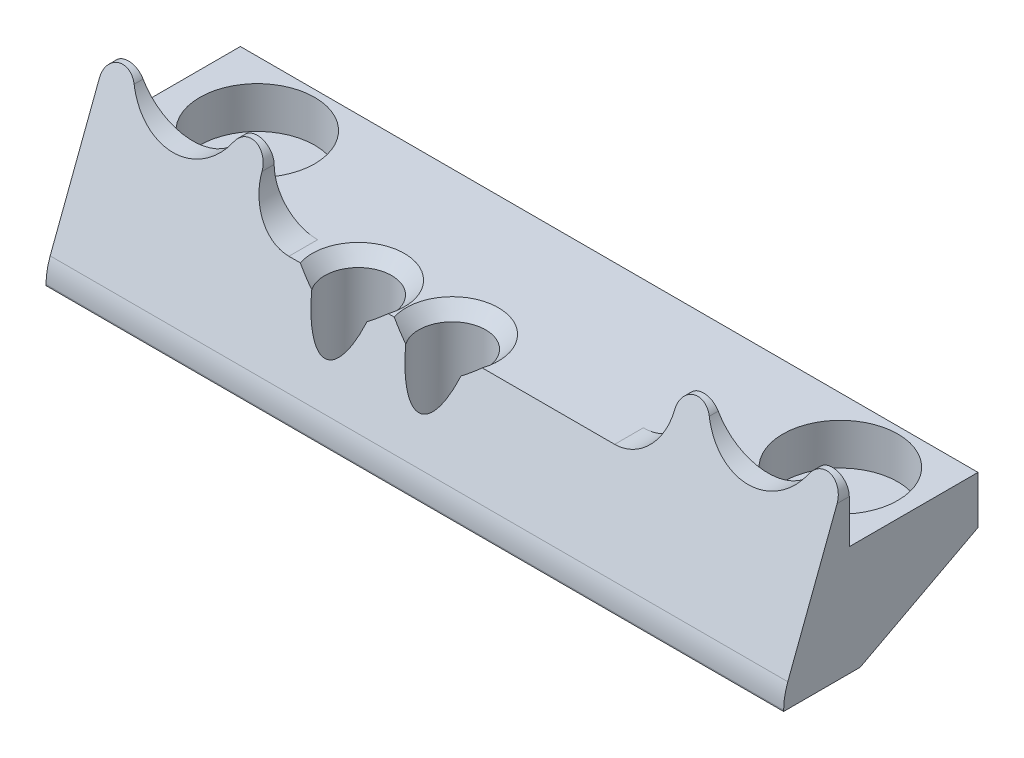
ISO-10303-21;
HEADER;
FILE_DESCRIPTION(('STEP AP214'),'2;1');
FILE_NAME('part.step','',(''),(''),'','','');
FILE_SCHEMA(('AUTOMOTIVE_DESIGN { 1 0 10303 214 1 1 1 1 }'));
ENDSEC;
DATA;
#1=APPLICATION_CONTEXT('core data for automotive mechanical design processes');
#2=APPLICATION_PROTOCOL_DEFINITION('international standard','automotive_design',2000,#1);
#3=PRODUCT_CONTEXT('',#1,'mechanical');
#4=PRODUCT('Part','Part','',(#3));
#5=PRODUCT_RELATED_PRODUCT_CATEGORY('part','',(#4));
#6=PRODUCT_DEFINITION_FORMATION('','',#4);
#7=PRODUCT_DEFINITION_CONTEXT('part definition',#1,'design');
#8=PRODUCT_DEFINITION('design','',#6,#7);
#9=PRODUCT_DEFINITION_SHAPE('','',#8);
#10=(LENGTH_UNIT() NAMED_UNIT(*) SI_UNIT(.MILLI.,.METRE.));
#11=(NAMED_UNIT(*) PLANE_ANGLE_UNIT() SI_UNIT($,.RADIAN.));
#12=(NAMED_UNIT(*) SI_UNIT($,.STERADIAN.) SOLID_ANGLE_UNIT());
#13=UNCERTAINTY_MEASURE_WITH_UNIT(LENGTH_MEASURE(1.E-05),#10,'distance_accuracy_value','');
#14=(GEOMETRIC_REPRESENTATION_CONTEXT(3) GLOBAL_UNCERTAINTY_ASSIGNED_CONTEXT((#13)) GLOBAL_UNIT_ASSIGNED_CONTEXT((#10,
#11,#12)) REPRESENTATION_CONTEXT('',''));
#15=CARTESIAN_POINT('',(0.,0.,0.));
#16=DIRECTION('',(0.,0.,1.));
#17=DIRECTION('',(1.,0.,0.));
#18=AXIS2_PLACEMENT_3D('',#15,#16,#17);
#19=CARTESIAN_POINT('',(0.,17.25,0.));
#20=DIRECTION('',(0.,-1.,0.));
#21=DIRECTION('',(0.,0.,-1.));
#22=AXIS2_PLACEMENT_3D('',#19,#20,#21);
#23=PLANE('',#22);
#24=CARTESIAN_POINT('',(-43.,17.25,-12.4));
#25=DIRECTION('',(0.,1.,0.));
#26=DIRECTION('',(0.,0.,1.));
#27=AXIS2_PLACEMENT_3D('',#24,#25,#26);
#28=CIRCLE('',#27,9.02499999999999);
#29=CARTESIAN_POINT('',(-43.,17.25,-3.37500000000001));
#30=VERTEX_POINT('',#29);
#31=EDGE_CURVE('E308',#30,#30,#28,.T.);
#32=ORIENTED_EDGE('',*,*,#31,.F.);
#33=EDGE_LOOP('',(#32));
#34=FACE_BOUND('',#33,.T.);
#35=CARTESIAN_POINT('',(48.5,17.25,-12.4));
#36=DIRECTION('',(0.,1.,0.));
#37=DIRECTION('',(0.,0.,1.));
#38=AXIS2_PLACEMENT_3D('',#35,#36,#37);
#39=CIRCLE('',#38,9.02499999999999);
#40=CARTESIAN_POINT('',(48.5,17.25,-3.37500000000001));
#41=VERTEX_POINT('',#40);
#42=EDGE_CURVE('E311',#41,#41,#39,.T.);
#43=ORIENTED_EDGE('',*,*,#42,.F.);
#44=EDGE_LOOP('',(#43));
#45=FACE_BOUND('',#44,.T.);
#46=DIRECTION('',(1.,0.,0.));
#47=VECTOR('',#46,1.);
#48=CARTESIAN_POINT('',(-55.75,17.25,2.2));
#49=LINE('',#48,#47);
#50=CARTESIAN_POINT('',(-7.84185263619838,17.25,2.2));
#51=VERTEX_POINT('',#50);
#52=CARTESIAN_POINT('',(-6.90814736380167,17.25,2.2));
#53=VERTEX_POINT('',#52);
#54=EDGE_CURVE('E276',#51,#53,#49,.T.);
#55=ORIENTED_EDGE('',*,*,#54,.T.);
#56=CARTESIAN_POINT('',(0.,17.25,0.));
#57=DIRECTION('',(0.,-1.,0.));
#58=DIRECTION('',(0.,0.,-1.));
#59=AXIS2_PLACEMENT_3D('',#56,#57,#58);
#60=CIRCLE('',#59,7.24999999999999);
#61=CARTESIAN_POINT('',(6.90814736380166,17.25,2.2));
#62=VERTEX_POINT('',#61);
#63=EDGE_CURVE('E46',#53,#62,#60,.T.);
#64=ORIENTED_EDGE('',*,*,#63,.T.);
#65=CARTESIAN_POINT('',(27.6845936651877,17.25,2.2));
#66=VERTEX_POINT('',#65);
#67=EDGE_CURVE('E277',#62,#66,#49,.T.);
#68=ORIENTED_EDGE('',*,*,#67,.T.);
#69=DIRECTION('',(0.,0.,-1.));
#70=VECTOR('',#69,1.);
#71=CARTESIAN_POINT('',(27.6845936651877,17.25,35.2491485571849));
#72=LINE('',#71,#70);
#73=CARTESIAN_POINT('',(27.6845936651877,17.25,-2.3));
#74=VERTEX_POINT('',#73);
#75=EDGE_CURVE('E260',#66,#74,#72,.T.);
#76=ORIENTED_EDGE('',*,*,#75,.T.);
#77=DIRECTION('',(-1.,0.,0.));
#78=VECTOR('',#77,1.);
#79=CARTESIAN_POINT('',(0.,17.25,-2.3));
#80=LINE('',#79,#78);
#81=CARTESIAN_POINT('',(60.,17.25,-2.3));
#82=VERTEX_POINT('',#81);
#83=EDGE_CURVE('E242',#82,#74,#80,.T.);
#84=ORIENTED_EDGE('',*,*,#83,.F.);
#85=DIRECTION('',(0.,0.,-1.));
#86=VECTOR('',#85,1.);
#87=CARTESIAN_POINT('',(60.,17.25,8.));
#88=LINE('',#87,#86);
#89=CARTESIAN_POINT('',(60.,17.25,-22.5));
#90=VERTEX_POINT('',#89);
#91=EDGE_CURVE('E323',#82,#90,#88,.T.);
#92=ORIENTED_EDGE('',*,*,#91,.T.);
#93=DIRECTION('',(-1.,0.,0.));
#94=VECTOR('',#93,1.);
#95=CARTESIAN_POINT('',(-55.75,17.25,-22.5));
#96=LINE('',#95,#94);
#97=CARTESIAN_POINT('',(-55.75,17.25,-22.5));
#98=VERTEX_POINT('',#97);
#99=EDGE_CURVE('E326',#90,#98,#96,.T.);
#100=ORIENTED_EDGE('',*,*,#99,.T.);
#101=DIRECTION('',(0.,0.,1.));
#102=VECTOR('',#101,1.);
#103=CARTESIAN_POINT('',(-55.75,17.25,8.));
#104=LINE('',#103,#102);
#105=CARTESIAN_POINT('',(-55.75,17.25,-2.3));
#106=VERTEX_POINT('',#105);
#107=EDGE_CURVE('E321',#98,#106,#104,.T.);
#108=ORIENTED_EDGE('',*,*,#107,.T.);
#109=DIRECTION('',(1.,0.,0.));
#110=VECTOR('',#109,1.);
#111=CARTESIAN_POINT('',(-55.75,17.25,-2.3));
#112=LINE('',#111,#110);
#113=CARTESIAN_POINT('',(-23.4345936651877,17.25,-2.3));
#114=VERTEX_POINT('',#113);
#115=EDGE_CURVE('E220',#106,#114,#112,.T.);
#116=ORIENTED_EDGE('',*,*,#115,.T.);
#117=DIRECTION('',(0.,0.,-1.));
#118=VECTOR('',#117,1.);
#119=CARTESIAN_POINT('',(-23.4345936651877,17.25,35.2491485571849));
#120=LINE('',#119,#118);
#121=CARTESIAN_POINT('',(-23.4345936651877,17.25,2.2));
#122=VERTEX_POINT('',#121);
#123=EDGE_CURVE('E489',#122,#114,#120,.T.);
#124=ORIENTED_EDGE('',*,*,#123,.F.);
#125=CARTESIAN_POINT('',(-21.6581473638016,17.25,2.2));
#126=VERTEX_POINT('',#125);
#127=EDGE_CURVE('E273',#122,#126,#49,.T.);
#128=ORIENTED_EDGE('',*,*,#127,.T.);
#129=CARTESIAN_POINT('',(-14.75,17.25,0.));
#130=DIRECTION('',(0.,-1.,0.));
#131=DIRECTION('',(0.,0.,-1.));
#132=AXIS2_PLACEMENT_3D('',#129,#130,#131);
#133=CIRCLE('',#132,7.24999999999995);
#134=EDGE_CURVE('E526',#126,#51,#133,.T.);
#135=ORIENTED_EDGE('',*,*,#134,.T.);
#136=EDGE_LOOP('',(#55,#64,#68,#76,#84,#92,#100,#108,#116,#124,#128,#135));
#137=FACE_BOUND('',#136,.T.);
#138=ADVANCED_FACE('F37',(#34,#45,#137),#23,.F.);
#139=CARTESIAN_POINT('',(-43.,17.25,-12.4));
#140=DIRECTION('',(0.,-1.,0.));
#141=DIRECTION('',(0.,0.,-1.));
#142=AXIS2_PLACEMENT_3D('',#139,#140,#141);
#143=CYLINDRICAL_SURFACE('',#142,9.02499999999999);
#144=ORIENTED_EDGE('',*,*,#31,.T.);
#145=EDGE_LOOP('',(#144));
#146=FACE_BOUND('',#145,.T.);
#147=CARTESIAN_POINT('',(-43.,10.75,-12.4));
#148=DIRECTION('',(0.,-1.,0.));
#149=DIRECTION('',(0.,0.,-1.));
#150=AXIS2_PLACEMENT_3D('',#147,#148,#149);
#151=CIRCLE('',#150,9.025);
#152=CARTESIAN_POINT('',(-43.,10.75,-21.425));
#153=VERTEX_POINT('',#152);
#154=EDGE_CURVE('E301',#153,#153,#151,.F.);
#155=ORIENTED_EDGE('',*,*,#154,.F.);
#156=EDGE_LOOP('',(#155));
#157=FACE_BOUND('',#156,.T.);
#158=ADVANCED_FACE('F424',(#146,#157),#143,.F.);
#159=CARTESIAN_POINT('',(48.5,17.25,-12.4));
#160=DIRECTION('',(0.,-1.,0.));
#161=DIRECTION('',(0.,0.,-1.));
#162=AXIS2_PLACEMENT_3D('',#159,#160,#161);
#163=CYLINDRICAL_SURFACE('',#162,9.02499999999999);
#164=ORIENTED_EDGE('',*,*,#42,.T.);
#165=EDGE_LOOP('',(#164));
#166=FACE_BOUND('',#165,.T.);
#167=CARTESIAN_POINT('',(48.5,10.75,-12.4));
#168=DIRECTION('',(0.,-1.,0.));
#169=DIRECTION('',(0.,0.,-1.));
#170=AXIS2_PLACEMENT_3D('',#167,#168,#169);
#171=CIRCLE('',#170,9.025);
#172=CARTESIAN_POINT('',(48.5,10.75,-21.425));
#173=VERTEX_POINT('',#172);
#174=EDGE_CURVE('E304',#173,#173,#171,.F.);
#175=ORIENTED_EDGE('',*,*,#174,.F.);
#176=EDGE_LOOP('',(#175));
#177=FACE_BOUND('',#176,.T.);
#178=ADVANCED_FACE('F420',(#166,#177),#163,.F.);
#179=CARTESIAN_POINT('',(0.,0.,0.));
#180=DIRECTION('',(0.,-1.,0.));
#181=DIRECTION('',(0.,0.,-1.));
#182=AXIS2_PLACEMENT_3D('',#179,#180,#181);
#183=PLANE('',#182);
#184=DIRECTION('',(1.,0.,0.));
#185=VECTOR('',#184,1.);
#186=CARTESIAN_POINT('',(-55.75,0.,-4.));
#187=LINE('',#186,#185);
#188=CARTESIAN_POINT('',(-55.75,0.,-4.));
#189=VERTEX_POINT('',#188);
#190=CARTESIAN_POINT('',(60.,0.,-4.));
#191=VERTEX_POINT('',#190);
#192=EDGE_CURVE('E270',#189,#191,#187,.T.);
#193=ORIENTED_EDGE('',*,*,#192,.T.);
#194=DIRECTION('',(0.,0.,-1.));
#195=VECTOR('',#194,1.);
#196=CARTESIAN_POINT('',(60.,0.,8.));
#197=LINE('',#196,#195);
#198=CARTESIAN_POINT('',(60.,0.,8.));
#199=VERTEX_POINT('',#198);
#200=EDGE_CURVE('E324',#199,#191,#197,.T.);
#201=ORIENTED_EDGE('',*,*,#200,.F.);
#202=DIRECTION('',(1.,0.,0.));
#203=VECTOR('',#202,1.);
#204=CARTESIAN_POINT('',(-55.75,0.,8.));
#205=LINE('',#204,#203);
#206=CARTESIAN_POINT('',(-55.75,0.,8.));
#207=VERTEX_POINT('',#206);
#208=EDGE_CURVE('E330',#207,#199,#205,.T.);
#209=ORIENTED_EDGE('',*,*,#208,.F.);
#210=DIRECTION('',(0.,0.,1.));
#211=VECTOR('',#210,1.);
#212=CARTESIAN_POINT('',(-55.75,0.,8.));
#213=LINE('',#212,#211);
#214=EDGE_CURVE('E320',#189,#207,#213,.T.);
#215=ORIENTED_EDGE('',*,*,#214,.F.);
#216=EDGE_LOOP('',(#193,#201,#209,#215));
#217=FACE_BOUND('',#216,.T.);
#218=CARTESIAN_POINT('',(0.,0.,0.));
#219=DIRECTION('',(0.,1.,0.));
#220=DIRECTION('',(0.,0.,1.));
#221=AXIS2_PLACEMENT_3D('',#218,#219,#220);
#222=CIRCLE('',#221,2.75);
#223=CARTESIAN_POINT('',(0.,0.,2.75));
#224=VERTEX_POINT('',#223);
#225=EDGE_CURVE('E317',#224,#224,#222,.T.);
#226=ORIENTED_EDGE('',*,*,#225,.T.);
#227=EDGE_LOOP('',(#226));
#228=FACE_BOUND('',#227,.T.);
#229=CARTESIAN_POINT('',(-14.75,0.,0.));
#230=DIRECTION('',(0.,1.,0.));
#231=DIRECTION('',(0.,0.,1.));
#232=AXIS2_PLACEMENT_3D('',#229,#230,#231);
#233=CIRCLE('',#232,2.75);
#234=CARTESIAN_POINT('',(-14.75,0.,2.75));
#235=VERTEX_POINT('',#234);
#236=EDGE_CURVE('E314',#235,#235,#233,.T.);
#237=ORIENTED_EDGE('',*,*,#236,.T.);
#238=EDGE_LOOP('',(#237));
#239=FACE_BOUND('',#238,.T.);
#240=ADVANCED_FACE('F404',(#217,#228,#239),#183,.T.);
#241=CARTESIAN_POINT('',(-55.75,17.25,8.));
#242=DIRECTION('',(1.,0.,0.));
#243=DIRECTION('',(0.,0.,-1.));
#244=AXIS2_PLACEMENT_3D('',#241,#242,#243);
#245=PLANE('',#244);
#246=CARTESIAN_POINT('',(-55.75,0.162563301635661,-2.));
#247=DIRECTION('',(-1.,0.,0.));
#248=DIRECTION('',(0.,0.,-1.));
#249=AXIS2_PLACEMENT_3D('',#246,#247,#248);
#250=CIRCLE('',#249,10.);
#251=CARTESIAN_POINT('',(-55.75,0.162563301635627,8.));
#252=VERTEX_POINT('',#251);
#253=CARTESIAN_POINT('',(-55.75,3.71741861115749,7.34681783969092));
#254=VERTEX_POINT('',#253);
#255=EDGE_CURVE('E266',#252,#254,#250,.T.);
#256=ORIENTED_EDGE('',*,*,#255,.T.);
#257=DIRECTION('',(0.,0.934681783969093,-0.35548553095218));
#258=VECTOR('',#257,1.);
#259=CARTESIAN_POINT('',(-55.75,17.25,2.2));
#260=LINE('',#259,#258);
#261=CARTESIAN_POINT('',(-55.75,24.0654063348123,-0.392088966682721));
#262=VERTEX_POINT('',#261);
#263=EDGE_CURVE('E269',#254,#262,#260,.T.);
#264=ORIENTED_EDGE('',*,*,#263,.T.);
#265=DIRECTION('',(0.,0.,-1.));
#266=VECTOR('',#265,1.);
#267=CARTESIAN_POINT('',(-55.75,24.0654063348123,35.2491485571849));
#268=LINE('',#267,#266);
#269=CARTESIAN_POINT('',(-55.75,24.0654063348123,-2.3));
#270=VERTEX_POINT('',#269);
#271=EDGE_CURVE('E206',#262,#270,#268,.T.);
#272=ORIENTED_EDGE('',*,*,#271,.T.);
#273=DIRECTION('',(0.,1.,0.));
#274=VECTOR('',#273,1.);
#275=CARTESIAN_POINT('',(-55.75,17.25,-2.3));
#276=LINE('',#275,#274);
#277=EDGE_CURVE('E217',#106,#270,#276,.T.);
#278=ORIENTED_EDGE('',*,*,#277,.F.);
#279=ORIENTED_EDGE('',*,*,#107,.F.);
#280=DIRECTION('',(0.,-1.,0.));
#281=VECTOR('',#280,1.);
#282=CARTESIAN_POINT('',(-55.75,17.25,-22.5));
#283=LINE('',#282,#281);
#284=CARTESIAN_POINT('',(-55.75,9.75,-22.5));
#285=VERTEX_POINT('',#284);
#286=EDGE_CURVE('E328',#98,#285,#283,.T.);
#287=ORIENTED_EDGE('',*,*,#286,.T.);
#288=DIRECTION('',(0.,-0.46623907672076,0.884658760957339));
#289=VECTOR('',#288,1.);
#290=CARTESIAN_POINT('',(-55.75,9.75,-22.5));
#291=LINE('',#290,#289);
#292=EDGE_CURVE('E236',#285,#189,#291,.T.);
#293=ORIENTED_EDGE('',*,*,#292,.T.);
#294=ORIENTED_EDGE('',*,*,#214,.T.);
#295=DIRECTION('',(0.,-1.,0.));
#296=VECTOR('',#295,1.);
#297=CARTESIAN_POINT('',(-55.75,17.25,8.));
#298=LINE('',#297,#296);
#299=EDGE_CURVE('E342',#252,#207,#298,.T.);
#300=ORIENTED_EDGE('',*,*,#299,.F.);
#301=EDGE_LOOP('',(#256,#264,#272,#278,#279,#287,#293,#294,#300));
#302=FACE_BOUND('',#301,.T.);
#303=ADVANCED_FACE('F399',(#302),#245,.F.);
#304=CARTESIAN_POINT('',(-55.75,17.25,8.));
#305=DIRECTION('',(0.,0.,-1.));
#306=DIRECTION('',(-1.,0.,0.));
#307=AXIS2_PLACEMENT_3D('',#304,#305,#306);
#308=PLANE('',#307);
#309=DIRECTION('',(0.,-1.,0.));
#310=VECTOR('',#309,1.);
#311=CARTESIAN_POINT('',(60.,17.25,8.));
#312=LINE('',#311,#310);
#313=CARTESIAN_POINT('',(60.,0.162563301635644,8.));
#314=VERTEX_POINT('',#313);
#315=EDGE_CURVE('E340',#314,#199,#312,.T.);
#316=ORIENTED_EDGE('',*,*,#315,.F.);
#317=DIRECTION('',(1.,0.,0.));
#318=VECTOR('',#317,1.);
#319=CARTESIAN_POINT('',(-55.75,0.162563301635627,8.));
#320=LINE('',#319,#318);
#321=EDGE_CURVE('E272',#252,#314,#320,.T.);
#322=ORIENTED_EDGE('',*,*,#321,.F.);
#323=ORIENTED_EDGE('',*,*,#299,.T.);
#324=ORIENTED_EDGE('',*,*,#208,.T.);
#325=EDGE_LOOP('',(#316,#322,#323,#324));
#326=FACE_BOUND('',#325,.T.);
#327=ADVANCED_FACE('F403',(#326),#308,.F.);
#328=CARTESIAN_POINT('',(60.,17.25,8.));
#329=DIRECTION('',(-1.,0.,0.));
#330=DIRECTION('',(0.,0.,1.));
#331=AXIS2_PLACEMENT_3D('',#328,#329,#330);
#332=PLANE('',#331);
#333=ORIENTED_EDGE('',*,*,#91,.F.);
#334=DIRECTION('',(0.,1.,0.));
#335=VECTOR('',#334,1.);
#336=CARTESIAN_POINT('',(60.,0.,-2.3));
#337=LINE('',#336,#335);
#338=CARTESIAN_POINT('',(60.,24.0654063348123,-2.3));
#339=VERTEX_POINT('',#338);
#340=EDGE_CURVE('E245',#82,#339,#337,.T.);
#341=ORIENTED_EDGE('',*,*,#340,.T.);
#342=DIRECTION('',(0.,0.,-1.));
#343=VECTOR('',#342,1.);
#344=CARTESIAN_POINT('',(60.,24.0654063348123,35.2491485571849));
#345=LINE('',#344,#343);
#346=CARTESIAN_POINT('',(60.,24.0654063348123,-0.392088966682726));
#347=VERTEX_POINT('',#346);
#348=EDGE_CURVE('E258',#347,#339,#345,.T.);
#349=ORIENTED_EDGE('',*,*,#348,.F.);
#350=DIRECTION('',(0.,-0.934681783969094,0.35548553095218));
#351=VECTOR('',#350,1.);
#352=CARTESIAN_POINT('',(60.,15.3228580685756,2.93294578375485));
#353=LINE('',#352,#351);
#354=CARTESIAN_POINT('',(60.,3.71741861115748,7.34681783969093));
#355=VERTEX_POINT('',#354);
#356=EDGE_CURVE('E288',#347,#355,#353,.T.);
#357=ORIENTED_EDGE('',*,*,#356,.T.);
#358=CARTESIAN_POINT('',(60.,0.162563301635661,-2.));
#359=DIRECTION('',(1.,0.,0.));
#360=DIRECTION('',(0.,0.,-1.));
#361=AXIS2_PLACEMENT_3D('',#358,#359,#360);
#362=CIRCLE('',#361,10.);
#363=EDGE_CURVE('E352',#355,#314,#362,.T.);
#364=ORIENTED_EDGE('',*,*,#363,.T.);
#365=ORIENTED_EDGE('',*,*,#315,.T.);
#366=ORIENTED_EDGE('',*,*,#200,.T.);
#367=DIRECTION('',(0.,0.46623907672076,-0.884658760957339));
#368=VECTOR('',#367,1.);
#369=CARTESIAN_POINT('',(60.,-1.19976418465056,-1.72352436758611));
#370=LINE('',#369,#368);
#371=CARTESIAN_POINT('',(60.,9.75,-22.5));
#372=VERTEX_POINT('',#371);
#373=EDGE_CURVE('E291',#191,#372,#370,.T.);
#374=ORIENTED_EDGE('',*,*,#373,.T.);
#375=DIRECTION('',(0.,-1.,0.));
#376=VECTOR('',#375,1.);
#377=CARTESIAN_POINT('',(60.,17.25,-22.5));
#378=LINE('',#377,#376);
#379=EDGE_CURVE('E337',#90,#372,#378,.T.);
#380=ORIENTED_EDGE('',*,*,#379,.F.);
#381=EDGE_LOOP('',(#333,#341,#349,#357,#364,#365,#366,#374,#380));
#382=FACE_BOUND('',#381,.T.);
#383=ADVANCED_FACE('F408',(#382),#332,.F.);
#384=CARTESIAN_POINT('',(-55.75,17.25,-22.5));
#385=DIRECTION('',(0.,0.,1.));
#386=DIRECTION('',(1.,0.,0.));
#387=AXIS2_PLACEMENT_3D('',#384,#385,#386);
#388=PLANE('',#387);
#389=ORIENTED_EDGE('',*,*,#379,.T.);
#390=DIRECTION('',(1.,0.,0.));
#391=VECTOR('',#390,1.);
#392=CARTESIAN_POINT('',(-55.75,9.75,-22.5));
#393=LINE('',#392,#391);
#394=EDGE_CURVE('E283',#285,#372,#393,.T.);
#395=ORIENTED_EDGE('',*,*,#394,.F.);
#396=ORIENTED_EDGE('',*,*,#286,.F.);
#397=ORIENTED_EDGE('',*,*,#99,.F.);
#398=EDGE_LOOP('',(#389,#395,#396,#397));
#399=FACE_BOUND('',#398,.T.);
#400=ADVANCED_FACE('F412',(#399),#388,.F.);
#401=CARTESIAN_POINT('',(0.,17.25,0.));
#402=DIRECTION('',(0.,-1.,0.));
#403=DIRECTION('',(0.,0.,-1.));
#404=AXIS2_PLACEMENT_3D('',#401,#402,#403);
#405=CYLINDRICAL_SURFACE('',#404,2.75);
#406=CARTESIAN_POINT('',(0.,3.,0.));
#407=DIRECTION('',(0.,-1.,0.));
#408=DIRECTION('',(0.,0.,-1.));
#409=AXIS2_PLACEMENT_3D('',#406,#407,#408);
#410=CIRCLE('',#409,2.75);
#411=CARTESIAN_POINT('',(0.,3.,-2.75));
#412=VERTEX_POINT('',#411);
#413=EDGE_CURVE('E305',#412,#412,#410,.T.);
#414=ORIENTED_EDGE('',*,*,#413,.F.);
#415=EDGE_LOOP('',(#414));
#416=FACE_BOUND('',#415,.T.);
#417=ORIENTED_EDGE('',*,*,#225,.F.);
#418=EDGE_LOOP('',(#417));
#419=FACE_BOUND('',#418,.T.);
#420=ADVANCED_FACE('F416',(#416,#419),#405,.F.);
#421=CARTESIAN_POINT('',(-14.75,17.25,0.));
#422=DIRECTION('',(0.,-1.,0.));
#423=DIRECTION('',(0.,0.,-1.));
#424=AXIS2_PLACEMENT_3D('',#421,#422,#423);
#425=CYLINDRICAL_SURFACE('',#424,2.75);
#426=CARTESIAN_POINT('',(-14.75,3.,0.));
#427=DIRECTION('',(0.,-1.,0.));
#428=DIRECTION('',(0.,0.,-1.));
#429=AXIS2_PLACEMENT_3D('',#426,#427,#428);
#430=CIRCLE('',#429,2.75);
#431=CARTESIAN_POINT('',(-14.75,3.,-2.75));
#432=VERTEX_POINT('',#431);
#433=EDGE_CURVE('E298',#432,#432,#430,.T.);
#434=ORIENTED_EDGE('',*,*,#433,.F.);
#435=EDGE_LOOP('',(#434));
#436=FACE_BOUND('',#435,.T.);
#437=ORIENTED_EDGE('',*,*,#236,.F.);
#438=EDGE_LOOP('',(#437));
#439=FACE_BOUND('',#438,.T.);
#440=ADVANCED_FACE('F428',(#436,#439),#425,.F.);
#441=CARTESIAN_POINT('',(0.,10.75,0.));
#442=DIRECTION('',(0.,-1.,0.));
#443=DIRECTION('',(0.,0.,-1.));
#444=AXIS2_PLACEMENT_3D('',#441,#442,#443);
#445=PLANE('',#444);
#446=ORIENTED_EDGE('',*,*,#174,.T.);
#447=EDGE_LOOP('',(#446));
#448=FACE_BOUND('',#447,.T.);
#449=ADVANCED_FACE('F432',(#448),#445,.F.);
#450=CARTESIAN_POINT('',(0.,10.75,0.));
#451=DIRECTION('',(0.,-1.,0.));
#452=DIRECTION('',(0.,0.,-1.));
#453=AXIS2_PLACEMENT_3D('',#450,#451,#452);
#454=PLANE('',#453);
#455=ORIENTED_EDGE('',*,*,#154,.T.);
#456=EDGE_LOOP('',(#455));
#457=FACE_BOUND('',#456,.T.);
#458=ADVANCED_FACE('F442',(#457),#454,.F.);
#459=CARTESIAN_POINT('',(0.,3.,0.));
#460=DIRECTION('',(0.,-1.,0.));
#461=DIRECTION('',(0.,0.,-1.));
#462=AXIS2_PLACEMENT_3D('',#459,#460,#461);
#463=PLANE('',#462);
#464=ORIENTED_EDGE('',*,*,#433,.T.);
#465=EDGE_LOOP('',(#464));
#466=FACE_BOUND('',#465,.T.);
#467=CARTESIAN_POINT('',(-14.75,3.,0.));
#468=DIRECTION('',(0.,-1.,0.));
#469=DIRECTION('',(0.,0.,-1.));
#470=AXIS2_PLACEMENT_3D('',#467,#468,#469);
#471=CIRCLE('',#470,5.25);
#472=CARTESIAN_POINT('',(-14.75,3.,-5.25));
#473=VERTEX_POINT('',#472);
#474=EDGE_CURVE('E295',#473,#473,#471,.F.);
#475=ORIENTED_EDGE('',*,*,#474,.T.);
#476=EDGE_LOOP('',(#475));
#477=FACE_BOUND('',#476,.T.);
#478=ADVANCED_FACE('F446',(#466,#477),#463,.F.);
#479=CARTESIAN_POINT('',(-14.75,-14.8492424049175,0.));
#480=DIRECTION('',(0.,1.,0.));
#481=DIRECTION('',(0.,0.,1.));
#482=AXIS2_PLACEMENT_3D('',#479,#480,#481);
#483=CYLINDRICAL_SURFACE('',#482,5.25);
#484=CARTESIAN_POINT('',(-14.75,23.0344827586207,0.));
#485=DIRECTION('',(0.,-0.35548553095218,-0.934681783969093));
#486=DIRECTION('',(0.,0.934681783969093,-0.35548553095218));
#487=AXIS2_PLACEMENT_3D('',#484,#485,#486);
#488=ELLIPSE('',#487,14.7685335769861,5.25);
#489=CARTESIAN_POINT('',(-19.085552744783,15.25,2.9606557377049));
#490=VERTEX_POINT('',#489);
#491=CARTESIAN_POINT('',(-10.414447255217,15.25,2.9606557377049));
#492=VERTEX_POINT('',#491);
#493=EDGE_CURVE('E275',#490,#492,#488,.F.);
#494=ORIENTED_EDGE('',*,*,#493,.T.);
#495=CARTESIAN_POINT('',(-14.75,15.25,0.));
#496=DIRECTION('',(0.,-1.,0.));
#497=DIRECTION('',(0.,0.,-1.));
#498=AXIS2_PLACEMENT_3D('',#495,#496,#497);
#499=CIRCLE('',#498,5.25);
#500=EDGE_CURVE('E12',#492,#490,#499,.F.);
#501=ORIENTED_EDGE('',*,*,#500,.T.);
#502=EDGE_LOOP('',(#494,#501));
#503=FACE_BOUND('',#502,.T.);
#504=ORIENTED_EDGE('',*,*,#474,.F.);
#505=EDGE_LOOP('',(#504));
#506=FACE_BOUND('',#505,.T.);
#507=ADVANCED_FACE('F452',(#503,#506),#483,.F.);
#508=CARTESIAN_POINT('',(0.,3.,0.));
#509=DIRECTION('',(0.,-1.,0.));
#510=DIRECTION('',(0.,0.,-1.));
#511=AXIS2_PLACEMENT_3D('',#508,#509,#510);
#512=PLANE('',#511);
#513=ORIENTED_EDGE('',*,*,#413,.T.);
#514=EDGE_LOOP('',(#513));
#515=FACE_BOUND('',#514,.T.);
#516=CARTESIAN_POINT('',(0.,3.,0.));
#517=DIRECTION('',(0.,-1.,0.));
#518=DIRECTION('',(0.,0.,-1.));
#519=AXIS2_PLACEMENT_3D('',#516,#517,#518);
#520=CIRCLE('',#519,5.25);
#521=CARTESIAN_POINT('',(0.,3.,-5.25));
#522=VERTEX_POINT('',#521);
#523=EDGE_CURVE('E294',#522,#522,#520,.F.);
#524=ORIENTED_EDGE('',*,*,#523,.T.);
#525=EDGE_LOOP('',(#524));
#526=FACE_BOUND('',#525,.T.);
#527=ADVANCED_FACE('F448',(#515,#526),#512,.F.);
#528=CARTESIAN_POINT('',(0.,-14.8492424049175,0.));
#529=DIRECTION('',(0.,1.,0.));
#530=DIRECTION('',(0.,0.,1.));
#531=AXIS2_PLACEMENT_3D('',#528,#529,#530);
#532=CYLINDRICAL_SURFACE('',#531,5.25);
#533=CARTESIAN_POINT('',(0.,23.0344827586207,0.));
#534=DIRECTION('',(0.,-0.35548553095218,-0.934681783969093));
#535=DIRECTION('',(0.,0.934681783969093,-0.35548553095218));
#536=AXIS2_PLACEMENT_3D('',#533,#534,#535);
#537=ELLIPSE('',#536,14.7685335769861,5.25);
#538=CARTESIAN_POINT('',(-4.33555274478294,15.25,2.96065573770492));
#539=VERTEX_POINT('',#538);
#540=CARTESIAN_POINT('',(4.33555274478295,15.25,2.96065573770492));
#541=VERTEX_POINT('',#540);
#542=EDGE_CURVE('E345',#539,#541,#537,.F.);
#543=ORIENTED_EDGE('',*,*,#542,.T.);
#544=CARTESIAN_POINT('',(0.,15.25,0.));
#545=DIRECTION('',(0.,-1.,0.));
#546=DIRECTION('',(0.,0.,-1.));
#547=AXIS2_PLACEMENT_3D('',#544,#545,#546);
#548=CIRCLE('',#547,5.25);
#549=EDGE_CURVE('E355',#541,#539,#548,.F.);
#550=ORIENTED_EDGE('',*,*,#549,.T.);
#551=EDGE_LOOP('',(#543,#550));
#552=FACE_BOUND('',#551,.T.);
#553=ORIENTED_EDGE('',*,*,#523,.F.);
#554=EDGE_LOOP('',(#553));
#555=FACE_BOUND('',#554,.T.);
#556=ADVANCED_FACE('F451',(#552,#555),#532,.F.);
#557=CARTESIAN_POINT('',(-55.75,0.162563301635661,-2.));
#558=DIRECTION('',(1.,0.,0.));
#559=DIRECTION('',(0.,0.,-1.));
#560=AXIS2_PLACEMENT_3D('',#557,#558,#559);
#561=CYLINDRICAL_SURFACE('',#560,10.);
#562=DIRECTION('',(1.,0.,0.));
#563=VECTOR('',#562,1.);
#564=CARTESIAN_POINT('',(-55.75,3.71741861115749,7.34681783969092));
#565=LINE('',#564,#563);
#566=EDGE_CURVE('E279',#254,#355,#565,.T.);
#567=ORIENTED_EDGE('',*,*,#566,.F.);
#568=ORIENTED_EDGE('',*,*,#255,.F.);
#569=ORIENTED_EDGE('',*,*,#321,.T.);
#570=ORIENTED_EDGE('',*,*,#363,.F.);
#571=EDGE_LOOP('',(#567,#568,#569,#570));
#572=FACE_BOUND('',#571,.T.);
#573=ADVANCED_FACE('F374',(#572),#561,.T.);
#574=CARTESIAN_POINT('',(-55.75,17.25,2.2));
#575=DIRECTION('',(0.,-0.35548553095218,-0.934681783969093));
#576=DIRECTION('',(0.,0.934681783969094,-0.35548553095218));
#577=AXIS2_PLACEMENT_3D('',#574,#575,#576);
#578=PLANE('',#577);
#579=ORIENTED_EDGE('',*,*,#542,.F.);
#580=CARTESIAN_POINT('',(-4.33555274478295,15.25,2.96065573770492));
#581=CARTESIAN_POINT('',(-4.44842135188795,15.3267613057676,2.931461273872));
#582=CARTESIAN_POINT('',(-4.56037461173402,15.4046857292579,2.90182444395439));
#583=CARTESIAN_POINT('',(-4.78261770512232,15.5625609062339,2.84178011435039));
#584=CARTESIAN_POINT('',(-4.89290770102092,15.6425114598738,2.81137269067096));
#585=CARTESIAN_POINT('',(-5.11193343771133,15.8040950193389,2.74991795985801));
#586=CARTESIAN_POINT('',(-5.22067025729512,15.8857267505458,2.71887113749734));
#587=CARTESIAN_POINT('',(-5.43682515110042,16.0505044461612,2.6562015876895));
#588=CARTESIAN_POINT('',(-5.5442431901248,16.133650450838,2.6245788449272));
#589=CARTESIAN_POINT('',(-5.86464966898344,16.3849994229569,2.52898382602294));
#590=CARTESIAN_POINT('',(-6.07587120308838,16.5551733683509,2.46426193203703));
#591=CARTESIAN_POINT('',(-6.38990428926546,16.8135338315887,2.36600024765806));
#592=CARTESIAN_POINT('',(-6.49415477750809,16.9002043126122,2.33303704831798));
#593=CARTESIAN_POINT('',(-6.70178261102814,17.0744497969976,2.26676663458453));
#594=CARTESIAN_POINT('',(-6.80515997743456,17.1620247783565,2.23345942855952));
#595=CARTESIAN_POINT('',(-6.90814736380166,17.25,2.2));
#596=B_SPLINE_CURVE_WITH_KNOTS('',3,(#580,#581,#582,#583,#584,#585,#586,#587,#588,#589,#590,
#591,#592,#593,#594,#595),.UNSPECIFIED.,.F.,.F.,(4,2,2,2,2,2,2,4),(0.,0.418734415941989,
0.837427689843061,1.25581442817999,1.67421230873692,2.51069870580539,2.929262138792,
3.34781541361478),.UNSPECIFIED.);
#597=EDGE_CURVE('E387',#539,#53,#596,.T.);
#598=ORIENTED_EDGE('',*,*,#597,.T.);
#599=ORIENTED_EDGE('',*,*,#54,.F.);
#600=CARTESIAN_POINT('',(-7.84185263619838,17.25,2.2));
#601=CARTESIAN_POINT('',(-7.94484002256548,17.1620247783564,2.23345942855951));
#602=CARTESIAN_POINT('',(-8.0482173889719,17.0744497969976,2.26676663458453));
#603=CARTESIAN_POINT('',(-8.25584522249194,16.9002043126122,2.33303704831798));
#604=CARTESIAN_POINT('',(-8.36009571073457,16.8135338315887,2.36600024765806));
#605=CARTESIAN_POINT('',(-8.67412879691165,16.5551733683509,2.46426193203702));
#606=CARTESIAN_POINT('',(-8.88535033101658,16.384999422957,2.52898382602293));
#607=CARTESIAN_POINT('',(-9.20575680987522,16.133650450838,2.62457884492719));
#608=CARTESIAN_POINT('',(-9.31317484889959,16.0505044461612,2.65620158768949));
#609=CARTESIAN_POINT('',(-9.52932974270488,15.8857267505458,2.71887113749733));
#610=CARTESIAN_POINT('',(-9.63806656228867,15.8040950193389,2.749917959858));
#611=CARTESIAN_POINT('',(-9.85709229897908,15.6425114598738,2.81137269067095));
#612=CARTESIAN_POINT('',(-9.96738229487769,15.5625609062339,2.84178011435037));
#613=CARTESIAN_POINT('',(-10.189625388266,15.4046857292579,2.90182444395437));
#614=CARTESIAN_POINT('',(-10.301578648112,15.3267613057676,2.93146127387199));
#615=CARTESIAN_POINT('',(-10.414447255217,15.25,2.9606557377049));
#616=B_SPLINE_CURVE_WITH_KNOTS('',3,(#600,#601,#602,#603,#604,#605,#606,#607,#608,#609,#610,
#611,#612,#613,#614,#615),.UNSPECIFIED.,.F.,.F.,(4,2,2,2,2,2,2,4),(0.,0.41855327482278,
0.837116707809374,1.67360310487783,2.09200098543475,2.51038772377167,2.92908099767274,
3.34781541361472),.UNSPECIFIED.);
#617=EDGE_CURVE('E59',#51,#492,#616,.T.);
#618=ORIENTED_EDGE('',*,*,#617,.T.);
#619=ORIENTED_EDGE('',*,*,#493,.F.);
#620=CARTESIAN_POINT('',(-19.085552744783,15.25,2.9606557377049));
#621=CARTESIAN_POINT('',(-19.198421351888,15.3267613057676,2.93146127387199));
#622=CARTESIAN_POINT('',(-19.310374611734,15.4046857292579,2.90182444395437));
#623=CARTESIAN_POINT('',(-19.5326177051223,15.5625609062339,2.84178011435038));
#624=CARTESIAN_POINT('',(-19.6429077010209,15.6425114598738,2.81137269067095));
#625=CARTESIAN_POINT('',(-19.8619334377113,15.8040950193389,2.749917959858));
#626=CARTESIAN_POINT('',(-19.9706702572951,15.8857267505458,2.71887113749733));
#627=CARTESIAN_POINT('',(-20.1868251511004,16.0505044461613,2.65620158768949));
#628=CARTESIAN_POINT('',(-20.2942431901248,16.133650450838,2.62457884492719));
#629=CARTESIAN_POINT('',(-20.6146496689834,16.384999422957,2.52898382602293));
#630=CARTESIAN_POINT('',(-20.8258712030884,16.5551733683509,2.46426193203702));
#631=CARTESIAN_POINT('',(-21.1399042892654,16.8135338315887,2.36600024765806));
#632=CARTESIAN_POINT('',(-21.2441547775081,16.9002043126122,2.33303704831798));
#633=CARTESIAN_POINT('',(-21.4517826110281,17.0744497969976,2.26676663458453));
#634=CARTESIAN_POINT('',(-21.5551599774345,17.1620247783565,2.23345942855951));
#635=CARTESIAN_POINT('',(-21.6581473638016,17.25,2.2));
#636=B_SPLINE_CURVE_WITH_KNOTS('',3,(#620,#621,#622,#623,#624,#625,#626,#627,#628,#629,#630,
#631,#632,#633,#634,#635),.UNSPECIFIED.,.F.,.F.,(4,2,2,2,2,2,2,4),(0.,0.418734415941977,
0.837427689843043,1.25581442817997,1.67421230873689,2.51069870580535,2.92926213879194,
3.34781541361472),.UNSPECIFIED.);
#637=EDGE_CURVE('E53',#490,#126,#636,.T.);
#638=ORIENTED_EDGE('',*,*,#637,.T.);
#639=ORIENTED_EDGE('',*,*,#127,.F.);
#640=CARTESIAN_POINT('',(-23.4345936651877,24.0654063348123,-0.392088966682726));
#641=DIRECTION('',(0.,-0.35548553095218,-0.934681783969093));
#642=DIRECTION('',(0.,0.934681783969094,-0.35548553095218));
#643=AXIS2_PLACEMENT_3D('',#640,#641,#642);
#644=ELLIPSE('',#643,7.29168627409315,6.81540633481233);
#645=CARTESIAN_POINT('',(-30.25,24.0654063348123,-0.392088966682726));
#646=VERTEX_POINT('',#645);
#647=EDGE_CURVE('E187',#122,#646,#644,.T.);
#648=ORIENTED_EDGE('',*,*,#647,.T.);
#649=CARTESIAN_POINT('',(-32.8941873303754,24.0654063348123,-0.392088966682726));
#650=DIRECTION('',(0.,-0.35548553095218,-0.934681783969093));
#651=DIRECTION('',(0.,0.934681783969094,-0.35548553095218));
#652=AXIS2_PLACEMENT_3D('',#649,#650,#651);
#653=ELLIPSE('',#652,2.8289706461882,2.64418733037538);
#654=CARTESIAN_POINT('',(-35.1841207308454,25.3875,-0.894918032786893));
#655=VERTEX_POINT('',#654);
#656=EDGE_CURVE('E179',#646,#655,#653,.F.);
#657=ORIENTED_EDGE('',*,*,#656,.T.);
#658=CARTESIAN_POINT('',(-43.,29.9,-2.61114754098361));
#659=DIRECTION('',(0.,-0.35548553095218,-0.934681783969093));
#660=DIRECTION('',(0.,0.934681783969094,-0.35548553095218));
#661=AXIS2_PLACEMENT_3D('',#658,#659,#660);
#662=ELLIPSE('',#661,9.65569261623529,9.025);
#663=CARTESIAN_POINT('',(-50.8158792691546,25.3875,-0.894918032786893));
#664=VERTEX_POINT('',#663);
#665=EDGE_CURVE('E184',#655,#664,#662,.T.);
#666=ORIENTED_EDGE('',*,*,#665,.T.);
#667=CARTESIAN_POINT('',(-53.1058126696246,24.0654063348123,-0.392088966682726));
#668=DIRECTION('',(0.,-0.35548553095218,-0.934681783969093));
#669=DIRECTION('',(0.,0.934681783969094,-0.35548553095218));
#670=AXIS2_PLACEMENT_3D('',#667,#668,#669);
#671=ELLIPSE('',#670,2.82897064618819,2.64418733037538);
#672=EDGE_CURVE('E199',#262,#664,#671,.T.);
#673=ORIENTED_EDGE('',*,*,#672,.F.);
#674=ORIENTED_EDGE('',*,*,#263,.F.);
#675=ORIENTED_EDGE('',*,*,#566,.T.);
#676=ORIENTED_EDGE('',*,*,#356,.F.);
#677=CARTESIAN_POINT('',(57.3558126696246,24.0654063348123,-0.392088966682726));
#678=DIRECTION('',(0.,-0.35548553095218,-0.934681783969093));
#679=DIRECTION('',(0.,0.934681783969094,-0.35548553095218));
#680=AXIS2_PLACEMENT_3D('',#677,#678,#679);
#681=ELLIPSE('',#680,2.82897064618819,2.64418733037538);
#682=CARTESIAN_POINT('',(55.0658792691546,25.3875,-0.894918032786886));
#683=VERTEX_POINT('',#682);
#684=EDGE_CURVE('E227',#347,#683,#681,.F.);
#685=ORIENTED_EDGE('',*,*,#684,.T.);
#686=CARTESIAN_POINT('',(47.25,29.9,-2.61114754098361));
#687=DIRECTION('',(0.,-0.35548553095218,-0.934681783969093));
#688=DIRECTION('',(0.,0.934681783969094,-0.35548553095218));
#689=AXIS2_PLACEMENT_3D('',#686,#687,#688);
#690=ELLIPSE('',#689,9.65569261623529,9.025);
#691=CARTESIAN_POINT('',(39.4341207308454,25.3875,-0.894918032786893));
#692=VERTEX_POINT('',#691);
#693=EDGE_CURVE('E230',#692,#683,#690,.F.);
#694=ORIENTED_EDGE('',*,*,#693,.F.);
#695=CARTESIAN_POINT('',(37.1441873303754,24.0654063348123,-0.392088966682726));
#696=DIRECTION('',(0.,-0.35548553095218,-0.934681783969093));
#697=DIRECTION('',(0.,0.934681783969094,-0.35548553095218));
#698=AXIS2_PLACEMENT_3D('',#695,#696,#697);
#699=ELLIPSE('',#698,2.8289706461882,2.64418733037538);
#700=CARTESIAN_POINT('',(34.5,24.0654063348123,-0.392088966682726));
#701=VERTEX_POINT('',#700);
#702=EDGE_CURVE('E233',#701,#692,#699,.T.);
#703=ORIENTED_EDGE('',*,*,#702,.F.);
#704=CARTESIAN_POINT('',(27.6845936651877,24.0654063348123,-0.392088966682726));
#705=DIRECTION('',(0.,-0.35548553095218,-0.934681783969093));
#706=DIRECTION('',(0.,0.934681783969094,-0.35548553095218));
#707=AXIS2_PLACEMENT_3D('',#704,#705,#706);
#708=ELLIPSE('',#707,7.29168627409315,6.81540633481233);
#709=EDGE_CURVE('E229',#66,#701,#708,.F.);
#710=ORIENTED_EDGE('',*,*,#709,.F.);
#711=ORIENTED_EDGE('',*,*,#67,.F.);
#712=CARTESIAN_POINT('',(6.90814736380166,17.25,2.2));
#713=CARTESIAN_POINT('',(6.80515997743456,17.1620247783565,2.23345942855952));
#714=CARTESIAN_POINT('',(6.70178261102814,17.0744497969976,2.26676663458453));
#715=CARTESIAN_POINT('',(6.49415477750809,16.9002043126122,2.33303704831798));
#716=CARTESIAN_POINT('',(6.38990428926546,16.8135338315887,2.36600024765806));
#717=CARTESIAN_POINT('',(6.07587120308838,16.5551733683509,2.46426193203703));
#718=CARTESIAN_POINT('',(5.86464966898344,16.3849994229569,2.52898382602294));
#719=CARTESIAN_POINT('',(5.5442431901248,16.133650450838,2.6245788449272));
#720=CARTESIAN_POINT('',(5.43682515110042,16.0505044461612,2.6562015876895));
#721=CARTESIAN_POINT('',(5.22067025729512,15.8857267505458,2.71887113749734));
#722=CARTESIAN_POINT('',(5.11193343771133,15.8040950193389,2.74991795985801));
#723=CARTESIAN_POINT('',(4.89290770102092,15.6425114598738,2.81137269067096));
#724=CARTESIAN_POINT('',(4.78261770512231,15.5625609062339,2.84178011435039));
#725=CARTESIAN_POINT('',(4.56037461173402,15.4046857292579,2.90182444395439));
#726=CARTESIAN_POINT('',(4.44842135188795,15.3267613057676,2.931461273872));
#727=CARTESIAN_POINT('',(4.33555274478295,15.25,2.96065573770492));
#728=B_SPLINE_CURVE_WITH_KNOTS('',3,(#712,#713,#714,#715,#716,#717,#718,#719,#720,#721,#722,
#723,#724,#725,#726,#727),.UNSPECIFIED.,.F.,.F.,(4,2,2,2,2,2,2,4),(0.,0.418553274822789,
0.837116707809393,1.67360310487787,2.0920009854348,2.51038772377173,2.9290809976728,
3.34781541361479),.UNSPECIFIED.);
#729=EDGE_CURVE('E382',#62,#541,#728,.T.);
#730=ORIENTED_EDGE('',*,*,#729,.T.);
#731=EDGE_LOOP('',(#579,#598,#599,#618,#619,#638,#639,#648,#657,#666,#673,#674,#675,#676,#685,
#694,#703,#710,#711,#730));
#732=FACE_BOUND('',#731,.T.);
#733=ADVANCED_FACE('F182',(#732),#578,.F.);
#734=CARTESIAN_POINT('',(-55.75,9.75,-22.5));
#735=DIRECTION('',(0.,0.884658760957339,0.46623907672076));
#736=DIRECTION('',(0.,-0.46623907672076,0.884658760957339));
#737=AXIS2_PLACEMENT_3D('',#734,#735,#736);
#738=PLANE('',#737);
#739=ORIENTED_EDGE('',*,*,#192,.F.);
#740=ORIENTED_EDGE('',*,*,#292,.F.);
#741=ORIENTED_EDGE('',*,*,#394,.T.);
#742=ORIENTED_EDGE('',*,*,#373,.F.);
#743=EDGE_LOOP('',(#739,#740,#741,#742));
#744=FACE_BOUND('',#743,.T.);
#745=ADVANCED_FACE('F373',(#744),#738,.F.);
#746=CARTESIAN_POINT('',(0.,0.,-2.3));
#747=DIRECTION('',(0.,0.,1.));
#748=DIRECTION('',(1.,0.,0.));
#749=AXIS2_PLACEMENT_3D('',#746,#747,#748);
#750=PLANE('',#749);
#751=CARTESIAN_POINT('',(37.1441873303754,24.0654063348123,-2.3));
#752=DIRECTION('',(0.,0.,1.));
#753=DIRECTION('',(1.,0.,0.));
#754=AXIS2_PLACEMENT_3D('',#751,#752,#753);
#755=CIRCLE('',#754,2.64418733037538);
#756=CARTESIAN_POINT('',(39.4341207308454,25.3875,-2.3));
#757=VERTEX_POINT('',#756);
#758=CARTESIAN_POINT('',(34.5,24.0654063348123,-2.3));
#759=VERTEX_POINT('',#758);
#760=EDGE_CURVE('E225',#757,#759,#755,.T.);
#761=ORIENTED_EDGE('',*,*,#760,.F.);
#762=CARTESIAN_POINT('',(47.25,29.9,-2.3));
#763=DIRECTION('',(0.,0.,1.));
#764=DIRECTION('',(1.,0.,0.));
#765=AXIS2_PLACEMENT_3D('',#762,#763,#764);
#766=CIRCLE('',#765,9.025);
#767=CARTESIAN_POINT('',(55.0658792691546,25.3875,-2.3));
#768=VERTEX_POINT('',#767);
#769=EDGE_CURVE('E251',#768,#757,#766,.F.);
#770=ORIENTED_EDGE('',*,*,#769,.F.);
#771=CARTESIAN_POINT('',(57.3558126696246,24.0654063348123,-2.3));
#772=DIRECTION('',(0.,0.,1.));
#773=DIRECTION('',(1.,0.,0.));
#774=AXIS2_PLACEMENT_3D('',#771,#772,#773);
#775=CIRCLE('',#774,2.64418733037538);
#776=EDGE_CURVE('E248',#768,#339,#775,.F.);
#777=ORIENTED_EDGE('',*,*,#776,.T.);
#778=ORIENTED_EDGE('',*,*,#340,.F.);
#779=ORIENTED_EDGE('',*,*,#83,.T.);
#780=CARTESIAN_POINT('',(27.6845936651877,24.0654063348123,-2.3));
#781=DIRECTION('',(0.,0.,1.));
#782=DIRECTION('',(1.,0.,0.));
#783=AXIS2_PLACEMENT_3D('',#780,#781,#782);
#784=CIRCLE('',#783,6.81540633481233);
#785=EDGE_CURVE('E239',#759,#74,#784,.F.);
#786=ORIENTED_EDGE('',*,*,#785,.F.);
#787=EDGE_LOOP('',(#761,#770,#777,#778,#779,#786));
#788=FACE_BOUND('',#787,.T.);
#789=ADVANCED_FACE('F463',(#788),#750,.F.);
#790=CARTESIAN_POINT('',(47.25,29.9,35.2491485571849));
#791=DIRECTION('',(0.,0.,-1.));
#792=DIRECTION('',(-1.,0.,0.));
#793=AXIS2_PLACEMENT_3D('',#790,#791,#792);
#794=CYLINDRICAL_SURFACE('',#793,9.025);
#795=DIRECTION('',(0.,0.,-1.));
#796=VECTOR('',#795,1.);
#797=CARTESIAN_POINT('',(39.4341207308454,25.3875,35.2491485571849));
#798=LINE('',#797,#796);
#799=EDGE_CURVE('E254',#692,#757,#798,.T.);
#800=ORIENTED_EDGE('',*,*,#799,.F.);
#801=ORIENTED_EDGE('',*,*,#693,.T.);
#802=DIRECTION('',(0.,0.,-1.));
#803=VECTOR('',#802,1.);
#804=CARTESIAN_POINT('',(55.0658792691546,25.3875,35.2491485571849));
#805=LINE('',#804,#803);
#806=EDGE_CURVE('E256',#683,#768,#805,.T.);
#807=ORIENTED_EDGE('',*,*,#806,.T.);
#808=ORIENTED_EDGE('',*,*,#769,.T.);
#809=EDGE_LOOP('',(#800,#801,#807,#808));
#810=FACE_BOUND('',#809,.T.);
#811=ADVANCED_FACE('F468',(#810),#794,.F.);
#812=CARTESIAN_POINT('',(57.3558126696246,24.0654063348123,35.2491485571849));
#813=DIRECTION('',(0.,0.,-1.));
#814=DIRECTION('',(-1.,0.,0.));
#815=AXIS2_PLACEMENT_3D('',#812,#813,#814);
#816=CYLINDRICAL_SURFACE('',#815,2.64418733037538);
#817=ORIENTED_EDGE('',*,*,#684,.F.);
#818=ORIENTED_EDGE('',*,*,#348,.T.);
#819=ORIENTED_EDGE('',*,*,#776,.F.);
#820=ORIENTED_EDGE('',*,*,#806,.F.);
#821=EDGE_LOOP('',(#817,#818,#819,#820));
#822=FACE_BOUND('',#821,.T.);
#823=ADVANCED_FACE('F510',(#822),#816,.T.);
#824=CARTESIAN_POINT('',(27.6845936651877,24.0654063348123,35.2491485571849));
#825=DIRECTION('',(0.,0.,-1.));
#826=DIRECTION('',(-1.,0.,0.));
#827=AXIS2_PLACEMENT_3D('',#824,#825,#826);
#828=CYLINDRICAL_SURFACE('',#827,6.81540633481233);
#829=ORIENTED_EDGE('',*,*,#75,.F.);
#830=ORIENTED_EDGE('',*,*,#709,.T.);
#831=DIRECTION('',(0.,0.,-1.));
#832=VECTOR('',#831,1.);
#833=CARTESIAN_POINT('',(34.5,24.0654063348123,35.2491485571849));
#834=LINE('',#833,#832);
#835=EDGE_CURVE('E262',#701,#759,#834,.T.);
#836=ORIENTED_EDGE('',*,*,#835,.T.);
#837=ORIENTED_EDGE('',*,*,#785,.T.);
#838=EDGE_LOOP('',(#829,#830,#836,#837));
#839=FACE_BOUND('',#838,.T.);
#840=ADVANCED_FACE('F522',(#839),#828,.F.);
#841=CARTESIAN_POINT('',(37.1441873303754,24.0654063348123,35.2491485571849));
#842=DIRECTION('',(0.,0.,-1.));
#843=DIRECTION('',(-1.,0.,0.));
#844=AXIS2_PLACEMENT_3D('',#841,#842,#843);
#845=CYLINDRICAL_SURFACE('',#844,2.64418733037538);
#846=ORIENTED_EDGE('',*,*,#835,.F.);
#847=ORIENTED_EDGE('',*,*,#702,.T.);
#848=ORIENTED_EDGE('',*,*,#799,.T.);
#849=ORIENTED_EDGE('',*,*,#760,.T.);
#850=EDGE_LOOP('',(#846,#847,#848,#849));
#851=FACE_BOUND('',#850,.T.);
#852=ADVANCED_FACE('F375',(#851),#845,.T.);
#853=CARTESIAN_POINT('',(-32.8941873303754,24.0654063348123,35.2491485571849));
#854=DIRECTION('',(0.,0.,-1.));
#855=DIRECTION('',(-1.,0.,0.));
#856=AXIS2_PLACEMENT_3D('',#853,#854,#855);
#857=CYLINDRICAL_SURFACE('',#856,2.64418733037538);
#858=ORIENTED_EDGE('',*,*,#656,.F.);
#859=DIRECTION('',(0.,0.,-1.));
#860=VECTOR('',#859,1.);
#861=CARTESIAN_POINT('',(-30.25,24.0654063348123,35.2491485571849));
#862=LINE('',#861,#860);
#863=CARTESIAN_POINT('',(-30.25,24.0654063348123,-2.3));
#864=VERTEX_POINT('',#863);
#865=EDGE_CURVE('E214',#646,#864,#862,.T.);
#866=ORIENTED_EDGE('',*,*,#865,.T.);
#867=CARTESIAN_POINT('',(-32.8941873303754,24.0654063348123,-2.3));
#868=DIRECTION('',(0.,0.,-1.));
#869=DIRECTION('',(-1.,0.,0.));
#870=AXIS2_PLACEMENT_3D('',#867,#868,#869);
#871=CIRCLE('',#870,2.64418733037538);
#872=CARTESIAN_POINT('',(-35.1841207308454,25.3875,-2.3));
#873=VERTEX_POINT('',#872);
#874=EDGE_CURVE('E203',#873,#864,#871,.T.);
#875=ORIENTED_EDGE('',*,*,#874,.F.);
#876=DIRECTION('',(0.,0.,-1.));
#877=VECTOR('',#876,1.);
#878=CARTESIAN_POINT('',(-35.1841207308454,25.3875,35.2491485571849));
#879=LINE('',#878,#877);
#880=EDGE_CURVE('E196',#655,#873,#879,.T.);
#881=ORIENTED_EDGE('',*,*,#880,.F.);
#882=EDGE_LOOP('',(#858,#866,#875,#881));
#883=FACE_BOUND('',#882,.T.);
#884=ADVANCED_FACE('F201',(#883),#857,.T.);
#885=CARTESIAN_POINT('',(-43.,29.9,35.2491485571849));
#886=DIRECTION('',(0.,0.,-1.));
#887=DIRECTION('',(-1.,0.,0.));
#888=AXIS2_PLACEMENT_3D('',#885,#886,#887);
#889=CYLINDRICAL_SURFACE('',#888,9.025);
#890=ORIENTED_EDGE('',*,*,#665,.F.);
#891=ORIENTED_EDGE('',*,*,#880,.T.);
#892=CARTESIAN_POINT('',(-43.,29.9,-2.3));
#893=DIRECTION('',(0.,0.,1.));
#894=DIRECTION('',(1.,0.,0.));
#895=AXIS2_PLACEMENT_3D('',#892,#893,#894);
#896=CIRCLE('',#895,9.025);
#897=CARTESIAN_POINT('',(-50.8158792691546,25.3875,-2.3));
#898=VERTEX_POINT('',#897);
#899=EDGE_CURVE('E211',#898,#873,#896,.T.);
#900=ORIENTED_EDGE('',*,*,#899,.F.);
#901=DIRECTION('',(0.,0.,-1.));
#902=VECTOR('',#901,1.);
#903=CARTESIAN_POINT('',(-50.8158792691546,25.3875,35.2491485571849));
#904=LINE('',#903,#902);
#905=EDGE_CURVE('E198',#664,#898,#904,.T.);
#906=ORIENTED_EDGE('',*,*,#905,.F.);
#907=EDGE_LOOP('',(#890,#891,#900,#906));
#908=FACE_BOUND('',#907,.T.);
#909=ADVANCED_FACE('F194',(#908),#889,.F.);
#910=CARTESIAN_POINT('',(-53.1058126696246,24.0654063348123,35.2491485571849));
#911=DIRECTION('',(0.,0.,-1.));
#912=DIRECTION('',(-1.,0.,0.));
#913=AXIS2_PLACEMENT_3D('',#910,#911,#912);
#914=CYLINDRICAL_SURFACE('',#913,2.64418733037538);
#915=ORIENTED_EDGE('',*,*,#271,.F.);
#916=ORIENTED_EDGE('',*,*,#672,.T.);
#917=ORIENTED_EDGE('',*,*,#905,.T.);
#918=CARTESIAN_POINT('',(-53.1058126696246,24.0654063348123,-2.3));
#919=DIRECTION('',(0.,0.,1.));
#920=DIRECTION('',(1.,0.,0.));
#921=AXIS2_PLACEMENT_3D('',#918,#919,#920);
#922=CIRCLE('',#921,2.64418733037538);
#923=EDGE_CURVE('E213',#898,#270,#922,.T.);
#924=ORIENTED_EDGE('',*,*,#923,.T.);
#925=EDGE_LOOP('',(#915,#916,#917,#924));
#926=FACE_BOUND('',#925,.T.);
#927=ADVANCED_FACE('F486',(#926),#914,.T.);
#928=CARTESIAN_POINT('',(-23.4345936651877,24.0654063348123,35.2491485571849));
#929=DIRECTION('',(0.,0.,-1.));
#930=DIRECTION('',(-1.,0.,0.));
#931=AXIS2_PLACEMENT_3D('',#928,#929,#930);
#932=CYLINDRICAL_SURFACE('',#931,6.81540633481233);
#933=ORIENTED_EDGE('',*,*,#647,.F.);
#934=ORIENTED_EDGE('',*,*,#123,.T.);
#935=CARTESIAN_POINT('',(-23.4345936651877,24.0654063348123,-2.3));
#936=DIRECTION('',(0.,0.,1.));
#937=DIRECTION('',(1.,0.,0.));
#938=AXIS2_PLACEMENT_3D('',#935,#936,#937);
#939=CIRCLE('',#938,6.81540633481233);
#940=EDGE_CURVE('E222',#864,#114,#939,.T.);
#941=ORIENTED_EDGE('',*,*,#940,.F.);
#942=ORIENTED_EDGE('',*,*,#865,.F.);
#943=EDGE_LOOP('',(#933,#934,#941,#942));
#944=FACE_BOUND('',#943,.T.);
#945=ADVANCED_FACE('F496',(#944),#932,.F.);
#946=CARTESIAN_POINT('',(-32.8941873303754,24.0654063348123,-2.3));
#947=DIRECTION('',(0.,0.,-1.));
#948=DIRECTION('',(-1.,0.,0.));
#949=AXIS2_PLACEMENT_3D('',#946,#947,#948);
#950=PLANE('',#949);
#951=ORIENTED_EDGE('',*,*,#874,.T.);
#952=ORIENTED_EDGE('',*,*,#940,.T.);
#953=ORIENTED_EDGE('',*,*,#115,.F.);
#954=ORIENTED_EDGE('',*,*,#277,.T.);
#955=ORIENTED_EDGE('',*,*,#923,.F.);
#956=ORIENTED_EDGE('',*,*,#899,.T.);
#957=EDGE_LOOP('',(#951,#952,#953,#954,#955,#956));
#958=FACE_BOUND('',#957,.T.);
#959=ADVANCED_FACE('F397',(#958),#950,.T.);
#960=CARTESIAN_POINT('',(0.,15.25,0.));
#961=DIRECTION('',(0.,1.,0.));
#962=DIRECTION('',(0.,0.,1.));
#963=AXIS2_PLACEMENT_3D('',#960,#961,#962);
#964=CONICAL_SURFACE('',#963,5.25,0.785398163397447);
#965=ORIENTED_EDGE('',*,*,#729,.F.);
#966=ORIENTED_EDGE('',*,*,#63,.F.);
#967=ORIENTED_EDGE('',*,*,#597,.F.);
#968=ORIENTED_EDGE('',*,*,#549,.F.);
#969=EDGE_LOOP('',(#965,#966,#967,#968));
#970=FACE_BOUND('',#969,.T.);
#971=ADVANCED_FACE('F393',(#970),#964,.F.);
#972=CARTESIAN_POINT('',(-14.75,15.25,0.));
#973=DIRECTION('',(0.,1.,0.));
#974=DIRECTION('',(0.,0.,1.));
#975=AXIS2_PLACEMENT_3D('',#972,#973,#974);
#976=CONICAL_SURFACE('',#975,5.25,0.785398163397447);
#977=ORIENTED_EDGE('',*,*,#617,.F.);
#978=ORIENTED_EDGE('',*,*,#134,.F.);
#979=ORIENTED_EDGE('',*,*,#637,.F.);
#980=ORIENTED_EDGE('',*,*,#500,.F.);
#981=EDGE_LOOP('',(#977,#978,#979,#980));
#982=FACE_BOUND('',#981,.T.);
#983=ADVANCED_FACE('F39',(#982),#976,.F.);
#984=CLOSED_SHELL('',(#138,#158,#178,#240,#303,#327,#383,#400,#420,#440,#449,#458,#478,#507,
#527,#556,#573,#733,#745,#789,#811,#823,#840,#852,#884,#909,#927,#945,#959,#971,#983));
#985=MANIFOLD_SOLID_BREP('B2',#984);
#986=ADVANCED_BREP_SHAPE_REPRESENTATION('',(#18,#985),#14);
#987=SHAPE_DEFINITION_REPRESENTATION(#9,#986);
ENDSEC;
END-ISO-10303-21;
